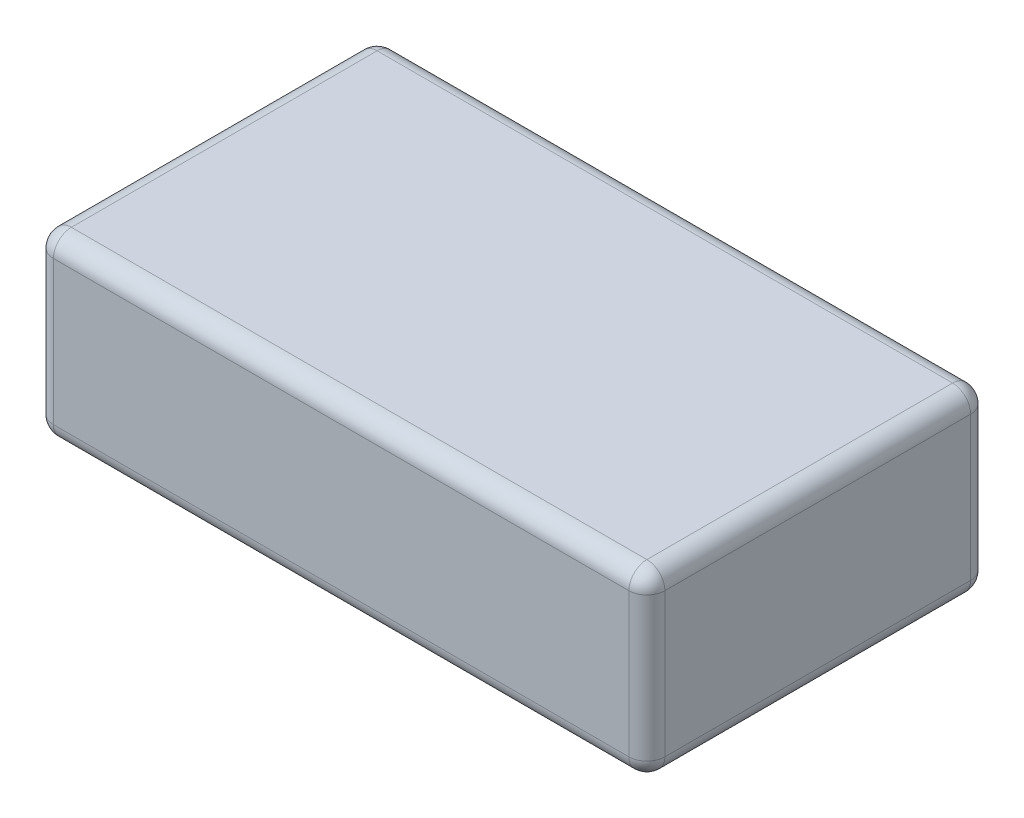
ISO-10303-21;
HEADER;
FILE_DESCRIPTION(('STEP AP214'),'2;1');
FILE_NAME('part.step','',(''),(''),'','','');
FILE_SCHEMA(('AUTOMOTIVE_DESIGN { 1 0 10303 214 1 1 1 1 }'));
ENDSEC;
DATA;
#1=APPLICATION_CONTEXT('core data for automotive mechanical design processes');
#2=APPLICATION_PROTOCOL_DEFINITION('international standard','automotive_design',2000,#1);
#3=PRODUCT_CONTEXT('',#1,'mechanical');
#4=PRODUCT('Part','Part','',(#3));
#5=PRODUCT_RELATED_PRODUCT_CATEGORY('part','',(#4));
#6=PRODUCT_DEFINITION_FORMATION('','',#4);
#7=PRODUCT_DEFINITION_CONTEXT('part definition',#1,'design');
#8=PRODUCT_DEFINITION('design','',#6,#7);
#9=PRODUCT_DEFINITION_SHAPE('','',#8);
#10=(LENGTH_UNIT() NAMED_UNIT(*) SI_UNIT(.MILLI.,.METRE.));
#11=(NAMED_UNIT(*) PLANE_ANGLE_UNIT() SI_UNIT($,.RADIAN.));
#12=(NAMED_UNIT(*) SI_UNIT($,.STERADIAN.) SOLID_ANGLE_UNIT());
#13=UNCERTAINTY_MEASURE_WITH_UNIT(LENGTH_MEASURE(1.E-05),#10,'distance_accuracy_value','');
#14=(GEOMETRIC_REPRESENTATION_CONTEXT(3) GLOBAL_UNCERTAINTY_ASSIGNED_CONTEXT((#13)) GLOBAL_UNIT_ASSIGNED_CONTEXT((#10,
#11,#12)) REPRESENTATION_CONTEXT('',''));
#15=CARTESIAN_POINT('',(0.,0.,0.));
#16=DIRECTION('',(0.,0.,1.));
#17=DIRECTION('',(1.,0.,0.));
#18=AXIS2_PLACEMENT_3D('',#15,#16,#17);
#19=CARTESIAN_POINT('',(34.,20.,-19.));
#20=DIRECTION('',(-1.,0.,0.));
#21=DIRECTION('',(0.,0.,1.));
#22=AXIS2_PLACEMENT_3D('',#19,#20,#21);
#23=PLANE('',#22);
#24=DIRECTION('',(0.,-1.,0.));
#25=VECTOR('',#24,1.);
#26=CARTESIAN_POINT('',(34.,20.,-17.));
#27=LINE('',#26,#25);
#28=CARTESIAN_POINT('',(34.,2.,-17.));
#29=VERTEX_POINT('',#28);
#30=CARTESIAN_POINT('',(34.,18.,-17.));
#31=VERTEX_POINT('',#30);
#32=EDGE_CURVE('E182',#29,#31,#27,.F.);
#33=ORIENTED_EDGE('',*,*,#32,.T.);
#34=DIRECTION('',(0.,0.,-1.));
#35=VECTOR('',#34,1.);
#36=CARTESIAN_POINT('',(34.,18.,19.));
#37=LINE('',#36,#35);
#38=CARTESIAN_POINT('',(34.,18.,17.));
#39=VERTEX_POINT('',#38);
#40=EDGE_CURVE('E185',#31,#39,#37,.F.);
#41=ORIENTED_EDGE('',*,*,#40,.T.);
#42=DIRECTION('',(0.,-1.,0.));
#43=VECTOR('',#42,1.);
#44=CARTESIAN_POINT('',(34.,20.,17.));
#45=LINE('',#44,#43);
#46=CARTESIAN_POINT('',(34.,2.,17.));
#47=VERTEX_POINT('',#46);
#48=EDGE_CURVE('E147',#39,#47,#45,.T.);
#49=ORIENTED_EDGE('',*,*,#48,.T.);
#50=DIRECTION('',(0.,0.,-1.));
#51=VECTOR('',#50,1.);
#52=CARTESIAN_POINT('',(34.,2.,-19.));
#53=LINE('',#52,#51);
#54=EDGE_CURVE('E180',#47,#29,#53,.T.);
#55=ORIENTED_EDGE('',*,*,#54,.T.);
#56=EDGE_LOOP('',(#33,#41,#49,#55));
#57=FACE_BOUND('',#56,.T.);
#58=ADVANCED_FACE('F39',(#57),#23,.F.);
#59=CARTESIAN_POINT('',(-34.,20.,-19.));
#60=DIRECTION('',(0.,0.,1.));
#61=DIRECTION('',(1.,0.,0.));
#62=AXIS2_PLACEMENT_3D('',#59,#60,#61);
#63=PLANE('',#62);
#64=DIRECTION('',(0.,-1.,0.));
#65=VECTOR('',#64,1.);
#66=CARTESIAN_POINT('',(32.,20.,-19.));
#67=LINE('',#66,#65);
#68=CARTESIAN_POINT('',(32.,18.,-19.));
#69=VERTEX_POINT('',#68);
#70=CARTESIAN_POINT('',(32.,2.,-19.));
#71=VERTEX_POINT('',#70);
#72=EDGE_CURVE('E200',#69,#71,#67,.T.);
#73=ORIENTED_EDGE('',*,*,#72,.T.);
#74=DIRECTION('',(-1.,0.,0.));
#75=VECTOR('',#74,1.);
#76=CARTESIAN_POINT('',(-34.,2.,-19.));
#77=LINE('',#76,#75);
#78=CARTESIAN_POINT('',(-32.,2.,-19.));
#79=VERTEX_POINT('',#78);
#80=EDGE_CURVE('E203',#71,#79,#77,.T.);
#81=ORIENTED_EDGE('',*,*,#80,.T.);
#82=DIRECTION('',(0.,-1.,0.));
#83=VECTOR('',#82,1.);
#84=CARTESIAN_POINT('',(-32.,20.,-19.));
#85=LINE('',#84,#83);
#86=CARTESIAN_POINT('',(-32.,18.,-19.));
#87=VERTEX_POINT('',#86);
#88=EDGE_CURVE('E198',#79,#87,#85,.F.);
#89=ORIENTED_EDGE('',*,*,#88,.T.);
#90=DIRECTION('',(-1.,0.,0.));
#91=VECTOR('',#90,1.);
#92=CARTESIAN_POINT('',(34.,18.,-19.));
#93=LINE('',#92,#91);
#94=EDGE_CURVE('E196',#87,#69,#93,.F.);
#95=ORIENTED_EDGE('',*,*,#94,.T.);
#96=EDGE_LOOP('',(#73,#81,#89,#95));
#97=FACE_BOUND('',#96,.T.);
#98=ADVANCED_FACE('F281',(#97),#63,.F.);
#99=CARTESIAN_POINT('',(-34.,20.,-19.));
#100=DIRECTION('',(1.,0.,0.));
#101=DIRECTION('',(0.,0.,-1.));
#102=AXIS2_PLACEMENT_3D('',#99,#100,#101);
#103=PLANE('',#102);
#104=DIRECTION('',(0.,-1.,0.));
#105=VECTOR('',#104,1.);
#106=CARTESIAN_POINT('',(-34.,20.,17.));
#107=LINE('',#106,#105);
#108=CARTESIAN_POINT('',(-34.,2.,17.));
#109=VERTEX_POINT('',#108);
#110=CARTESIAN_POINT('',(-34.,18.,17.));
#111=VERTEX_POINT('',#110);
#112=EDGE_CURVE('E175',#109,#111,#107,.F.);
#113=ORIENTED_EDGE('',*,*,#112,.T.);
#114=DIRECTION('',(0.,0.,1.));
#115=VECTOR('',#114,1.);
#116=CARTESIAN_POINT('',(-34.,18.,-19.));
#117=LINE('',#116,#115);
#118=CARTESIAN_POINT('',(-34.,18.,-17.));
#119=VERTEX_POINT('',#118);
#120=EDGE_CURVE('E178',#111,#119,#117,.F.);
#121=ORIENTED_EDGE('',*,*,#120,.T.);
#122=DIRECTION('',(0.,-1.,0.));
#123=VECTOR('',#122,1.);
#124=CARTESIAN_POINT('',(-34.,20.,-17.));
#125=LINE('',#124,#123);
#126=CARTESIAN_POINT('',(-34.,2.,-17.));
#127=VERTEX_POINT('',#126);
#128=EDGE_CURVE('E173',#119,#127,#125,.T.);
#129=ORIENTED_EDGE('',*,*,#128,.T.);
#130=DIRECTION('',(0.,0.,1.));
#131=VECTOR('',#130,1.);
#132=CARTESIAN_POINT('',(-34.,2.,-19.));
#133=LINE('',#132,#131);
#134=EDGE_CURVE('E171',#127,#109,#133,.T.);
#135=ORIENTED_EDGE('',*,*,#134,.T.);
#136=EDGE_LOOP('',(#113,#121,#129,#135));
#137=FACE_BOUND('',#136,.T.);
#138=ADVANCED_FACE('F308',(#137),#103,.F.);
#139=CARTESIAN_POINT('',(-34.,20.,19.));
#140=DIRECTION('',(0.,0.,-1.));
#141=DIRECTION('',(-1.,0.,0.));
#142=AXIS2_PLACEMENT_3D('',#139,#140,#141);
#143=PLANE('',#142);
#144=DIRECTION('',(0.,-1.,0.));
#145=VECTOR('',#144,1.);
#146=CARTESIAN_POINT('',(-32.,20.,19.));
#147=LINE('',#146,#145);
#148=CARTESIAN_POINT('',(-32.,18.,19.));
#149=VERTEX_POINT('',#148);
#150=CARTESIAN_POINT('',(-32.,2.,19.));
#151=VERTEX_POINT('',#150);
#152=EDGE_CURVE('E139',#149,#151,#147,.T.);
#153=ORIENTED_EDGE('',*,*,#152,.T.);
#154=DIRECTION('',(1.,0.,0.));
#155=VECTOR('',#154,1.);
#156=CARTESIAN_POINT('',(-34.,2.,19.));
#157=LINE('',#156,#155);
#158=CARTESIAN_POINT('',(32.,2.,19.));
#159=VERTEX_POINT('',#158);
#160=EDGE_CURVE('E135',#151,#159,#157,.T.);
#161=ORIENTED_EDGE('',*,*,#160,.T.);
#162=DIRECTION('',(0.,-1.,0.));
#163=VECTOR('',#162,1.);
#164=CARTESIAN_POINT('',(32.,20.,19.));
#165=LINE('',#164,#163);
#166=CARTESIAN_POINT('',(32.,18.,19.));
#167=VERTEX_POINT('',#166);
#168=EDGE_CURVE('E127',#159,#167,#165,.F.);
#169=ORIENTED_EDGE('',*,*,#168,.T.);
#170=DIRECTION('',(1.,0.,0.));
#171=VECTOR('',#170,1.);
#172=CARTESIAN_POINT('',(-34.,18.,19.));
#173=LINE('',#172,#171);
#174=EDGE_CURVE('E132',#167,#149,#173,.F.);
#175=ORIENTED_EDGE('',*,*,#174,.T.);
#176=EDGE_LOOP('',(#153,#161,#169,#175));
#177=FACE_BOUND('',#176,.T.);
#178=ADVANCED_FACE('F130',(#177),#143,.F.);
#179=CARTESIAN_POINT('',(0.,20.,0.));
#180=DIRECTION('',(0.,1.,0.));
#181=DIRECTION('',(0.,0.,1.));
#182=AXIS2_PLACEMENT_3D('',#179,#180,#181);
#183=PLANE('',#182);
#184=DIRECTION('',(0.,0.,1.));
#185=VECTOR('',#184,1.);
#186=CARTESIAN_POINT('',(-32.,20.,19.));
#187=LINE('',#186,#185);
#188=CARTESIAN_POINT('',(-32.,20.,-17.));
#189=VERTEX_POINT('',#188);
#190=CARTESIAN_POINT('',(-32.,20.,17.));
#191=VERTEX_POINT('',#190);
#192=EDGE_CURVE('E48',#189,#191,#187,.T.);
#193=ORIENTED_EDGE('',*,*,#192,.T.);
#194=DIRECTION('',(1.,0.,0.));
#195=VECTOR('',#194,1.);
#196=CARTESIAN_POINT('',(34.,20.,17.));
#197=LINE('',#196,#195);
#198=CARTESIAN_POINT('',(32.,20.,17.));
#199=VERTEX_POINT('',#198);
#200=EDGE_CURVE('E11',#191,#199,#197,.T.);
#201=ORIENTED_EDGE('',*,*,#200,.T.);
#202=DIRECTION('',(0.,0.,-1.));
#203=VECTOR('',#202,1.);
#204=CARTESIAN_POINT('',(32.,20.,-19.));
#205=LINE('',#204,#203);
#206=CARTESIAN_POINT('',(32.,20.,-17.));
#207=VERTEX_POINT('',#206);
#208=EDGE_CURVE('E205',#199,#207,#205,.T.);
#209=ORIENTED_EDGE('',*,*,#208,.T.);
#210=DIRECTION('',(-1.,0.,0.));
#211=VECTOR('',#210,1.);
#212=CARTESIAN_POINT('',(-34.,20.,-17.));
#213=LINE('',#212,#211);
#214=EDGE_CURVE('E59',#207,#189,#213,.T.);
#215=ORIENTED_EDGE('',*,*,#214,.T.);
#216=EDGE_LOOP('',(#193,#201,#209,#215));
#217=FACE_BOUND('',#216,.T.);
#218=ADVANCED_FACE('F370',(#217),#183,.T.);
#219=CARTESIAN_POINT('',(0.,0.,0.));
#220=DIRECTION('',(0.,1.,0.));
#221=DIRECTION('',(0.,0.,1.));
#222=AXIS2_PLACEMENT_3D('',#219,#220,#221);
#223=PLANE('',#222);
#224=DIRECTION('',(1.,0.,0.));
#225=VECTOR('',#224,1.);
#226=CARTESIAN_POINT('',(0.,0.,17.));
#227=LINE('',#226,#225);
#228=CARTESIAN_POINT('',(32.,0.,17.));
#229=VERTEX_POINT('',#228);
#230=CARTESIAN_POINT('',(-32.,0.,17.));
#231=VERTEX_POINT('',#230);
#232=EDGE_CURVE('E191',#229,#231,#227,.F.);
#233=ORIENTED_EDGE('',*,*,#232,.T.);
#234=DIRECTION('',(0.,0.,1.));
#235=VECTOR('',#234,1.);
#236=CARTESIAN_POINT('',(-32.,0.,0.));
#237=LINE('',#236,#235);
#238=CARTESIAN_POINT('',(-32.,0.,-17.));
#239=VERTEX_POINT('',#238);
#240=EDGE_CURVE('E194',#231,#239,#237,.F.);
#241=ORIENTED_EDGE('',*,*,#240,.T.);
#242=DIRECTION('',(-1.,0.,0.));
#243=VECTOR('',#242,1.);
#244=CARTESIAN_POINT('',(0.,0.,-17.));
#245=LINE('',#244,#243);
#246=CARTESIAN_POINT('',(32.,0.,-17.));
#247=VERTEX_POINT('',#246);
#248=EDGE_CURVE('E189',#239,#247,#245,.F.);
#249=ORIENTED_EDGE('',*,*,#248,.T.);
#250=DIRECTION('',(0.,0.,-1.));
#251=VECTOR('',#250,1.);
#252=CARTESIAN_POINT('',(32.,0.,0.));
#253=LINE('',#252,#251);
#254=EDGE_CURVE('E187',#247,#229,#253,.F.);
#255=ORIENTED_EDGE('',*,*,#254,.T.);
#256=EDGE_LOOP('',(#233,#241,#249,#255));
#257=FACE_BOUND('',#256,.T.);
#258=ADVANCED_FACE('F272',(#257),#223,.F.);
#259=CARTESIAN_POINT('',(32.,20.,-17.));
#260=DIRECTION('',(0.,-1.,0.));
#261=DIRECTION('',(0.,0.,-1.));
#262=AXIS2_PLACEMENT_3D('',#259,#260,#261);
#263=CYLINDRICAL_SURFACE('',#262,2.);
#264=CARTESIAN_POINT('',(32.,18.,-17.));
#265=DIRECTION('',(0.,1.,0.));
#266=DIRECTION('',(0.,0.,1.));
#267=AXIS2_PLACEMENT_3D('',#264,#265,#266);
#268=CIRCLE('',#267,2.);
#269=EDGE_CURVE('E43',#31,#69,#268,.T.);
#270=ORIENTED_EDGE('',*,*,#269,.F.);
#271=ORIENTED_EDGE('',*,*,#32,.F.);
#272=CARTESIAN_POINT('',(32.,2.,-17.));
#273=DIRECTION('',(0.,-1.,0.));
#274=DIRECTION('',(0.,0.,-1.));
#275=AXIS2_PLACEMENT_3D('',#272,#273,#274);
#276=CIRCLE('',#275,2.);
#277=EDGE_CURVE('E167',#71,#29,#276,.T.);
#278=ORIENTED_EDGE('',*,*,#277,.F.);
#279=ORIENTED_EDGE('',*,*,#72,.F.);
#280=EDGE_LOOP('',(#270,#271,#278,#279));
#281=FACE_BOUND('',#280,.T.);
#282=ADVANCED_FACE('F41',(#281),#263,.T.);
#283=CARTESIAN_POINT('',(32.,18.,-17.));
#284=DIRECTION('',(0.,0.,1.));
#285=DIRECTION('',(1.,0.,0.));
#286=AXIS2_PLACEMENT_3D('',#283,#284,#285);
#287=SPHERICAL_SURFACE('',#286,2.);
#288=CARTESIAN_POINT('',(32.,18.,-17.));
#289=DIRECTION('',(0.,0.,-1.));
#290=DIRECTION('',(-1.,0.,0.));
#291=AXIS2_PLACEMENT_3D('',#288,#289,#290);
#292=CIRCLE('',#291,2.);
#293=EDGE_CURVE('E251',#31,#207,#292,.F.);
#294=ORIENTED_EDGE('',*,*,#293,.F.);
#295=ORIENTED_EDGE('',*,*,#269,.T.);
#296=CARTESIAN_POINT('',(32.,18.,-17.));
#297=DIRECTION('',(1.,0.,0.));
#298=DIRECTION('',(0.,0.,-1.));
#299=AXIS2_PLACEMENT_3D('',#296,#297,#298);
#300=CIRCLE('',#299,2.);
#301=EDGE_CURVE('E254',#207,#69,#300,.F.);
#302=ORIENTED_EDGE('',*,*,#301,.F.);
#303=EDGE_LOOP('',(#294,#295,#302));
#304=FACE_BOUND('',#303,.T.);
#305=ADVANCED_FACE('F298',(#304),#287,.T.);
#306=CARTESIAN_POINT('',(32.,2.,-17.));
#307=DIRECTION('',(0.,0.,1.));
#308=DIRECTION('',(1.,0.,0.));
#309=AXIS2_PLACEMENT_3D('',#306,#307,#308);
#310=SPHERICAL_SURFACE('',#309,2.);
#311=CARTESIAN_POINT('',(32.,2.,-17.));
#312=DIRECTION('',(1.,0.,0.));
#313=DIRECTION('',(0.,0.,-1.));
#314=AXIS2_PLACEMENT_3D('',#311,#312,#313);
#315=CIRCLE('',#314,2.);
#316=EDGE_CURVE('E245',#71,#247,#315,.F.);
#317=ORIENTED_EDGE('',*,*,#316,.F.);
#318=ORIENTED_EDGE('',*,*,#277,.T.);
#319=CARTESIAN_POINT('',(32.,2.,-17.));
#320=DIRECTION('',(0.,0.,-1.));
#321=DIRECTION('',(-1.,0.,0.));
#322=AXIS2_PLACEMENT_3D('',#319,#320,#321);
#323=CIRCLE('',#322,2.);
#324=EDGE_CURVE('E248',#247,#29,#323,.F.);
#325=ORIENTED_EDGE('',*,*,#324,.F.);
#326=EDGE_LOOP('',(#317,#318,#325));
#327=FACE_BOUND('',#326,.T.);
#328=ADVANCED_FACE('F261',(#327),#310,.T.);
#329=CARTESIAN_POINT('',(0.,18.,-17.));
#330=DIRECTION('',(1.,0.,0.));
#331=DIRECTION('',(0.,0.,-1.));
#332=AXIS2_PLACEMENT_3D('',#329,#330,#331);
#333=CYLINDRICAL_SURFACE('',#332,2.);
#334=ORIENTED_EDGE('',*,*,#301,.T.);
#335=ORIENTED_EDGE('',*,*,#94,.F.);
#336=CARTESIAN_POINT('',(-32.,18.,-17.));
#337=DIRECTION('',(-1.,0.,0.));
#338=DIRECTION('',(0.,0.,1.));
#339=AXIS2_PLACEMENT_3D('',#336,#337,#338);
#340=CIRCLE('',#339,2.);
#341=EDGE_CURVE('E239',#189,#87,#340,.T.);
#342=ORIENTED_EDGE('',*,*,#341,.F.);
#343=ORIENTED_EDGE('',*,*,#214,.F.);
#344=EDGE_LOOP('',(#334,#335,#342,#343));
#345=FACE_BOUND('',#344,.T.);
#346=ADVANCED_FACE('F293',(#345),#333,.T.);
#347=CARTESIAN_POINT('',(32.,18.,0.));
#348=DIRECTION('',(0.,0.,1.));
#349=DIRECTION('',(1.,0.,0.));
#350=AXIS2_PLACEMENT_3D('',#347,#348,#349);
#351=CYLINDRICAL_SURFACE('',#350,2.);
#352=ORIENTED_EDGE('',*,*,#293,.T.);
#353=ORIENTED_EDGE('',*,*,#208,.F.);
#354=CARTESIAN_POINT('',(32.,18.,17.));
#355=DIRECTION('',(0.,0.,1.));
#356=DIRECTION('',(0.,-1.,0.));
#357=AXIS2_PLACEMENT_3D('',#354,#355,#356);
#358=CIRCLE('',#357,2.);
#359=EDGE_CURVE('E151',#39,#199,#358,.T.);
#360=ORIENTED_EDGE('',*,*,#359,.F.);
#361=ORIENTED_EDGE('',*,*,#40,.F.);
#362=EDGE_LOOP('',(#352,#353,#360,#361));
#363=FACE_BOUND('',#362,.T.);
#364=ADVANCED_FACE('F301',(#363),#351,.T.);
#365=CARTESIAN_POINT('',(32.,20.,17.));
#366=DIRECTION('',(0.,-1.,0.));
#367=DIRECTION('',(0.,0.,-1.));
#368=AXIS2_PLACEMENT_3D('',#365,#366,#367);
#369=CYLINDRICAL_SURFACE('',#368,2.);
#370=CARTESIAN_POINT('',(32.,2.,17.));
#371=DIRECTION('',(0.,-1.,0.));
#372=DIRECTION('',(0.,0.,-1.));
#373=AXIS2_PLACEMENT_3D('',#370,#371,#372);
#374=CIRCLE('',#373,2.);
#375=EDGE_CURVE('E152',#47,#159,#374,.T.);
#376=ORIENTED_EDGE('',*,*,#375,.F.);
#377=ORIENTED_EDGE('',*,*,#48,.F.);
#378=CARTESIAN_POINT('',(32.,18.,17.));
#379=DIRECTION('',(0.,1.,0.));
#380=DIRECTION('',(0.,0.,1.));
#381=AXIS2_PLACEMENT_3D('',#378,#379,#380);
#382=CIRCLE('',#381,2.);
#383=EDGE_CURVE('E143',#167,#39,#382,.T.);
#384=ORIENTED_EDGE('',*,*,#383,.F.);
#385=ORIENTED_EDGE('',*,*,#168,.F.);
#386=EDGE_LOOP('',(#376,#377,#384,#385));
#387=FACE_BOUND('',#386,.T.);
#388=ADVANCED_FACE('F145',(#387),#369,.T.);
#389=CARTESIAN_POINT('',(32.,2.,-19.));
#390=DIRECTION('',(0.,0.,-1.));
#391=DIRECTION('',(-1.,0.,0.));
#392=AXIS2_PLACEMENT_3D('',#389,#390,#391);
#393=CYLINDRICAL_SURFACE('',#392,2.);
#394=ORIENTED_EDGE('',*,*,#324,.T.);
#395=ORIENTED_EDGE('',*,*,#54,.F.);
#396=CARTESIAN_POINT('',(32.,2.,17.));
#397=DIRECTION('',(0.,0.,1.));
#398=DIRECTION('',(1.,0.,0.));
#399=AXIS2_PLACEMENT_3D('',#396,#397,#398);
#400=CIRCLE('',#399,2.);
#401=EDGE_CURVE('E235',#229,#47,#400,.T.);
#402=ORIENTED_EDGE('',*,*,#401,.F.);
#403=ORIENTED_EDGE('',*,*,#254,.F.);
#404=EDGE_LOOP('',(#394,#395,#402,#403));
#405=FACE_BOUND('',#404,.T.);
#406=ADVANCED_FACE('F268',(#405),#393,.T.);
#407=CARTESIAN_POINT('',(-34.,2.,-17.));
#408=DIRECTION('',(-1.,0.,0.));
#409=DIRECTION('',(0.,0.,1.));
#410=AXIS2_PLACEMENT_3D('',#407,#408,#409);
#411=CYLINDRICAL_SURFACE('',#410,2.);
#412=ORIENTED_EDGE('',*,*,#316,.T.);
#413=ORIENTED_EDGE('',*,*,#248,.F.);
#414=CARTESIAN_POINT('',(-32.,2.,-17.));
#415=DIRECTION('',(-1.,0.,0.));
#416=DIRECTION('',(0.,0.,1.));
#417=AXIS2_PLACEMENT_3D('',#414,#415,#416);
#418=CIRCLE('',#417,2.);
#419=EDGE_CURVE('E232',#79,#239,#418,.T.);
#420=ORIENTED_EDGE('',*,*,#419,.F.);
#421=ORIENTED_EDGE('',*,*,#80,.F.);
#422=EDGE_LOOP('',(#412,#413,#420,#421));
#423=FACE_BOUND('',#422,.T.);
#424=ADVANCED_FACE('F278',(#423),#411,.T.);
#425=CARTESIAN_POINT('',(-32.,20.,-17.));
#426=DIRECTION('',(0.,-1.,0.));
#427=DIRECTION('',(0.,0.,-1.));
#428=AXIS2_PLACEMENT_3D('',#425,#426,#427);
#429=CYLINDRICAL_SURFACE('',#428,2.);
#430=CARTESIAN_POINT('',(-32.,18.,-17.));
#431=DIRECTION('',(0.,1.,0.));
#432=DIRECTION('',(0.,0.,1.));
#433=AXIS2_PLACEMENT_3D('',#430,#431,#432);
#434=CIRCLE('',#433,2.);
#435=EDGE_CURVE('E242',#87,#119,#434,.T.);
#436=ORIENTED_EDGE('',*,*,#435,.F.);
#437=ORIENTED_EDGE('',*,*,#88,.F.);
#438=CARTESIAN_POINT('',(-32.,2.,-17.));
#439=DIRECTION('',(0.,-1.,0.));
#440=DIRECTION('',(0.,0.,-1.));
#441=AXIS2_PLACEMENT_3D('',#438,#439,#440);
#442=CIRCLE('',#441,2.);
#443=EDGE_CURVE('E229',#127,#79,#442,.T.);
#444=ORIENTED_EDGE('',*,*,#443,.F.);
#445=ORIENTED_EDGE('',*,*,#128,.F.);
#446=EDGE_LOOP('',(#436,#437,#444,#445));
#447=FACE_BOUND('',#446,.T.);
#448=ADVANCED_FACE('F286',(#447),#429,.T.);
#449=CARTESIAN_POINT('',(-32.,18.,-17.));
#450=DIRECTION('',(0.,0.,1.));
#451=DIRECTION('',(1.,0.,0.));
#452=AXIS2_PLACEMENT_3D('',#449,#450,#451);
#453=SPHERICAL_SURFACE('',#452,2.);
#454=ORIENTED_EDGE('',*,*,#341,.T.);
#455=ORIENTED_EDGE('',*,*,#435,.T.);
#456=CARTESIAN_POINT('',(-32.,18.,-17.));
#457=DIRECTION('',(0.,0.,-1.));
#458=DIRECTION('',(-1.,0.,0.));
#459=AXIS2_PLACEMENT_3D('',#456,#457,#458);
#460=CIRCLE('',#459,2.);
#461=EDGE_CURVE('E158',#189,#119,#460,.F.);
#462=ORIENTED_EDGE('',*,*,#461,.F.);
#463=EDGE_LOOP('',(#454,#455,#462));
#464=FACE_BOUND('',#463,.T.);
#465=ADVANCED_FACE('F291',(#464),#453,.T.);
#466=CARTESIAN_POINT('',(32.,18.,17.));
#467=DIRECTION('',(0.,0.,1.));
#468=DIRECTION('',(1.,0.,0.));
#469=AXIS2_PLACEMENT_3D('',#466,#467,#468);
#470=SPHERICAL_SURFACE('',#469,2.);
#471=ORIENTED_EDGE('',*,*,#383,.T.);
#472=ORIENTED_EDGE('',*,*,#359,.T.);
#473=CARTESIAN_POINT('',(32.,18.,17.));
#474=DIRECTION('',(1.,0.,0.));
#475=DIRECTION('',(0.,0.,-1.));
#476=AXIS2_PLACEMENT_3D('',#473,#474,#475);
#477=CIRCLE('',#476,2.);
#478=EDGE_CURVE('E154',#167,#199,#477,.F.);
#479=ORIENTED_EDGE('',*,*,#478,.F.);
#480=EDGE_LOOP('',(#471,#472,#479));
#481=FACE_BOUND('',#480,.T.);
#482=ADVANCED_FACE('F155',(#481),#470,.T.);
#483=CARTESIAN_POINT('',(32.,2.,17.));
#484=DIRECTION('',(0.,0.,1.));
#485=DIRECTION('',(1.,0.,0.));
#486=AXIS2_PLACEMENT_3D('',#483,#484,#485);
#487=SPHERICAL_SURFACE('',#486,2.);
#488=ORIENTED_EDGE('',*,*,#401,.T.);
#489=ORIENTED_EDGE('',*,*,#375,.T.);
#490=CARTESIAN_POINT('',(32.,2.,17.));
#491=DIRECTION('',(1.,0.,0.));
#492=DIRECTION('',(0.,0.,-1.));
#493=AXIS2_PLACEMENT_3D('',#490,#491,#492);
#494=CIRCLE('',#493,2.);
#495=EDGE_CURVE('E159',#229,#159,#494,.F.);
#496=ORIENTED_EDGE('',*,*,#495,.F.);
#497=EDGE_LOOP('',(#488,#489,#496));
#498=FACE_BOUND('',#497,.T.);
#499=ADVANCED_FACE('F341',(#498),#487,.T.);
#500=CARTESIAN_POINT('',(-32.,2.,-17.));
#501=DIRECTION('',(0.,0.,1.));
#502=DIRECTION('',(1.,0.,0.));
#503=AXIS2_PLACEMENT_3D('',#500,#501,#502);
#504=SPHERICAL_SURFACE('',#503,2.);
#505=ORIENTED_EDGE('',*,*,#443,.T.);
#506=ORIENTED_EDGE('',*,*,#419,.T.);
#507=CARTESIAN_POINT('',(-32.,2.,-17.));
#508=DIRECTION('',(0.,0.,-1.));
#509=DIRECTION('',(-1.,0.,0.));
#510=AXIS2_PLACEMENT_3D('',#507,#508,#509);
#511=CIRCLE('',#510,2.);
#512=EDGE_CURVE('E222',#127,#239,#511,.F.);
#513=ORIENTED_EDGE('',*,*,#512,.F.);
#514=EDGE_LOOP('',(#505,#506,#513));
#515=FACE_BOUND('',#514,.T.);
#516=ADVANCED_FACE('F337',(#515),#504,.T.);
#517=CARTESIAN_POINT('',(-32.,18.,0.));
#518=DIRECTION('',(0.,0.,-1.));
#519=DIRECTION('',(-1.,0.,0.));
#520=AXIS2_PLACEMENT_3D('',#517,#518,#519);
#521=CYLINDRICAL_SURFACE('',#520,2.);
#522=ORIENTED_EDGE('',*,*,#461,.T.);
#523=ORIENTED_EDGE('',*,*,#120,.F.);
#524=CARTESIAN_POINT('',(-32.,18.,17.));
#525=DIRECTION('',(0.,0.,1.));
#526=DIRECTION('',(1.,0.,0.));
#527=AXIS2_PLACEMENT_3D('',#524,#525,#526);
#528=CIRCLE('',#527,2.);
#529=EDGE_CURVE('E219',#191,#111,#528,.T.);
#530=ORIENTED_EDGE('',*,*,#529,.F.);
#531=ORIENTED_EDGE('',*,*,#192,.F.);
#532=EDGE_LOOP('',(#522,#523,#530,#531));
#533=FACE_BOUND('',#532,.T.);
#534=ADVANCED_FACE('F334',(#533),#521,.T.);
#535=CARTESIAN_POINT('',(0.,18.,17.));
#536=DIRECTION('',(-1.,0.,0.));
#537=DIRECTION('',(0.,0.,1.));
#538=AXIS2_PLACEMENT_3D('',#535,#536,#537);
#539=CYLINDRICAL_SURFACE('',#538,2.);
#540=ORIENTED_EDGE('',*,*,#478,.T.);
#541=ORIENTED_EDGE('',*,*,#200,.F.);
#542=CARTESIAN_POINT('',(-32.,18.,17.));
#543=DIRECTION('',(-1.,0.,0.));
#544=DIRECTION('',(0.,0.,1.));
#545=AXIS2_PLACEMENT_3D('',#542,#543,#544);
#546=CIRCLE('',#545,2.);
#547=EDGE_CURVE('E163',#149,#191,#546,.T.);
#548=ORIENTED_EDGE('',*,*,#547,.F.);
#549=ORIENTED_EDGE('',*,*,#174,.F.);
#550=EDGE_LOOP('',(#540,#541,#548,#549));
#551=FACE_BOUND('',#550,.T.);
#552=ADVANCED_FACE('F161',(#551),#539,.T.);
#553=CARTESIAN_POINT('',(-34.,2.,17.));
#554=DIRECTION('',(1.,0.,0.));
#555=DIRECTION('',(0.,0.,-1.));
#556=AXIS2_PLACEMENT_3D('',#553,#554,#555);
#557=CYLINDRICAL_SURFACE('',#556,2.);
#558=ORIENTED_EDGE('',*,*,#495,.T.);
#559=ORIENTED_EDGE('',*,*,#160,.F.);
#560=CARTESIAN_POINT('',(-32.,2.,17.));
#561=DIRECTION('',(-1.,0.,0.));
#562=DIRECTION('',(0.,0.,1.));
#563=AXIS2_PLACEMENT_3D('',#560,#561,#562);
#564=CIRCLE('',#563,2.);
#565=EDGE_CURVE('E215',#231,#151,#564,.T.);
#566=ORIENTED_EDGE('',*,*,#565,.F.);
#567=ORIENTED_EDGE('',*,*,#232,.F.);
#568=EDGE_LOOP('',(#558,#559,#566,#567));
#569=FACE_BOUND('',#568,.T.);
#570=ADVANCED_FACE('F327',(#569),#557,.T.);
#571=CARTESIAN_POINT('',(-32.,2.,-19.));
#572=DIRECTION('',(0.,0.,1.));
#573=DIRECTION('',(1.,0.,0.));
#574=AXIS2_PLACEMENT_3D('',#571,#572,#573);
#575=CYLINDRICAL_SURFACE('',#574,2.);
#576=ORIENTED_EDGE('',*,*,#512,.T.);
#577=ORIENTED_EDGE('',*,*,#240,.F.);
#578=CARTESIAN_POINT('',(-32.,2.,17.));
#579=DIRECTION('',(0.,0.,1.));
#580=DIRECTION('',(1.,0.,0.));
#581=AXIS2_PLACEMENT_3D('',#578,#579,#580);
#582=CIRCLE('',#581,2.);
#583=EDGE_CURVE('E213',#109,#231,#582,.T.);
#584=ORIENTED_EDGE('',*,*,#583,.F.);
#585=ORIENTED_EDGE('',*,*,#134,.F.);
#586=EDGE_LOOP('',(#576,#577,#584,#585));
#587=FACE_BOUND('',#586,.T.);
#588=ADVANCED_FACE('F323',(#587),#575,.T.);
#589=CARTESIAN_POINT('',(-32.,18.,17.));
#590=DIRECTION('',(0.,0.,1.));
#591=DIRECTION('',(1.,0.,0.));
#592=AXIS2_PLACEMENT_3D('',#589,#590,#591);
#593=SPHERICAL_SURFACE('',#592,2.);
#594=ORIENTED_EDGE('',*,*,#547,.T.);
#595=ORIENTED_EDGE('',*,*,#529,.T.);
#596=CARTESIAN_POINT('',(-32.,18.,17.));
#597=DIRECTION('',(0.,1.,0.));
#598=DIRECTION('',(0.,0.,1.));
#599=AXIS2_PLACEMENT_3D('',#596,#597,#598);
#600=CIRCLE('',#599,2.);
#601=EDGE_CURVE('E211',#149,#111,#600,.F.);
#602=ORIENTED_EDGE('',*,*,#601,.F.);
#603=EDGE_LOOP('',(#594,#595,#602));
#604=FACE_BOUND('',#603,.T.);
#605=ADVANCED_FACE('F319',(#604),#593,.T.);
#606=CARTESIAN_POINT('',(-32.,2.,17.));
#607=DIRECTION('',(0.,0.,1.));
#608=DIRECTION('',(1.,0.,0.));
#609=AXIS2_PLACEMENT_3D('',#606,#607,#608);
#610=SPHERICAL_SURFACE('',#609,2.);
#611=ORIENTED_EDGE('',*,*,#583,.T.);
#612=ORIENTED_EDGE('',*,*,#565,.T.);
#613=CARTESIAN_POINT('',(-32.,2.,17.));
#614=DIRECTION('',(0.,-1.,0.));
#615=DIRECTION('',(0.,0.,-1.));
#616=AXIS2_PLACEMENT_3D('',#613,#614,#615);
#617=CIRCLE('',#616,2.);
#618=EDGE_CURVE('E209',#109,#151,#617,.F.);
#619=ORIENTED_EDGE('',*,*,#618,.F.);
#620=EDGE_LOOP('',(#611,#612,#619));
#621=FACE_BOUND('',#620,.T.);
#622=ADVANCED_FACE('F315',(#621),#610,.T.);
#623=CARTESIAN_POINT('',(-32.,20.,17.));
#624=DIRECTION('',(0.,-1.,0.));
#625=DIRECTION('',(0.,0.,-1.));
#626=AXIS2_PLACEMENT_3D('',#623,#624,#625);
#627=CYLINDRICAL_SURFACE('',#626,2.);
#628=ORIENTED_EDGE('',*,*,#601,.T.);
#629=ORIENTED_EDGE('',*,*,#112,.F.);
#630=ORIENTED_EDGE('',*,*,#618,.T.);
#631=ORIENTED_EDGE('',*,*,#152,.F.);
#632=EDGE_LOOP('',(#628,#629,#630,#631));
#633=FACE_BOUND('',#632,.T.);
#634=ADVANCED_FACE('F312',(#633),#627,.T.);
#635=CLOSED_SHELL('',(#58,#98,#138,#178,#218,#258,#282,#305,#328,#346,#364,#388,#406,#424,#448,
#465,#482,#499,#516,#534,#552,#570,#588,#605,#622,#634));
#636=MANIFOLD_SOLID_BREP('B2',#635);
#637=ADVANCED_BREP_SHAPE_REPRESENTATION('',(#18,#636),#14);
#638=SHAPE_DEFINITION_REPRESENTATION(#9,#637);
ENDSEC;
END-ISO-10303-21;
